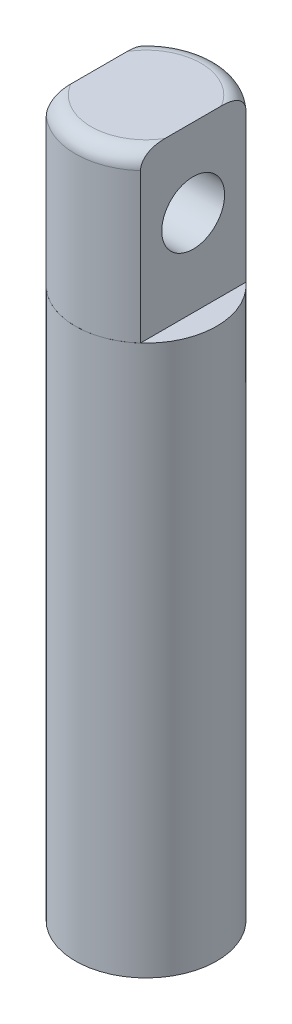
ISO-10303-21;
HEADER;
FILE_DESCRIPTION(('STEP AP214'),'2;1');
FILE_NAME('part.step','',(''),(''),'','','');
FILE_SCHEMA(('AUTOMOTIVE_DESIGN { 1 0 10303 214 1 1 1 1 }'));
ENDSEC;
DATA;
#1=APPLICATION_CONTEXT('core data for automotive mechanical design processes');
#2=APPLICATION_PROTOCOL_DEFINITION('international standard','automotive_design',2000,#1);
#3=PRODUCT_CONTEXT('',#1,'mechanical');
#4=PRODUCT('Part','Part','',(#3));
#5=PRODUCT_RELATED_PRODUCT_CATEGORY('part','',(#4));
#6=PRODUCT_DEFINITION_FORMATION('','',#4);
#7=PRODUCT_DEFINITION_CONTEXT('part definition',#1,'design');
#8=PRODUCT_DEFINITION('design','',#6,#7);
#9=PRODUCT_DEFINITION_SHAPE('','',#8);
#10=(LENGTH_UNIT() NAMED_UNIT(*) SI_UNIT(.MILLI.,.METRE.));
#11=(NAMED_UNIT(*) PLANE_ANGLE_UNIT() SI_UNIT($,.RADIAN.));
#12=(NAMED_UNIT(*) SI_UNIT($,.STERADIAN.) SOLID_ANGLE_UNIT());
#13=UNCERTAINTY_MEASURE_WITH_UNIT(LENGTH_MEASURE(1.E-05),#10,'distance_accuracy_value','');
#14=(GEOMETRIC_REPRESENTATION_CONTEXT(3) GLOBAL_UNCERTAINTY_ASSIGNED_CONTEXT((#13)) GLOBAL_UNIT_ASSIGNED_CONTEXT((#10,
#11,#12)) REPRESENTATION_CONTEXT('',''));
#15=CARTESIAN_POINT('',(0.,0.,0.));
#16=DIRECTION('',(0.,0.,1.));
#17=DIRECTION('',(1.,0.,0.));
#18=AXIS2_PLACEMENT_3D('',#15,#16,#17);
#19=CARTESIAN_POINT('',(0.,-35.,0.));
#20=DIRECTION('',(0.,1.,0.));
#21=DIRECTION('',(0.,0.,1.));
#22=AXIS2_PLACEMENT_3D('',#19,#20,#21);
#23=CYLINDRICAL_SURFACE('',#22,4.5);
#24=CARTESIAN_POINT('',(0.,-35.,0.));
#25=DIRECTION('',(0.,-1.,0.));
#26=DIRECTION('',(0.,0.,-1.));
#27=AXIS2_PLACEMENT_3D('',#24,#25,#26);
#28=CIRCLE('',#27,4.5);
#29=CARTESIAN_POINT('',(0.,-35.,-4.5));
#30=VERTEX_POINT('',#29);
#31=EDGE_CURVE('E11',#30,#30,#28,.T.);
#32=ORIENTED_EDGE('',*,*,#31,.F.);
#33=EDGE_LOOP('',(#32));
#34=FACE_BOUND('',#33,.T.);
#35=CARTESIAN_POINT('',(0.,0.,0.));
#36=DIRECTION('',(0.,-1.,0.));
#37=DIRECTION('',(0.,0.,-1.));
#38=AXIS2_PLACEMENT_3D('',#35,#36,#37);
#39=CIRCLE('',#38,4.5);
#40=CARTESIAN_POINT('',(0.,0.,-4.5));
#41=VERTEX_POINT('',#40);
#42=EDGE_CURVE('E47',#41,#41,#39,.T.);
#43=ORIENTED_EDGE('',*,*,#42,.T.);
#44=EDGE_LOOP('',(#43));
#45=FACE_BOUND('',#44,.T.);
#46=ADVANCED_FACE('F44',(#34,#45),#23,.T.);
#47=CARTESIAN_POINT('',(0.,-35.,0.));
#48=DIRECTION('',(0.,-1.,0.));
#49=DIRECTION('',(0.,0.,-1.));
#50=AXIS2_PLACEMENT_3D('',#47,#48,#49);
#51=PLANE('',#50);
#52=ORIENTED_EDGE('',*,*,#31,.T.);
#53=EDGE_LOOP('',(#52));
#54=FACE_BOUND('',#53,.T.);
#55=ADVANCED_FACE('F59',(#54),#51,.T.);
#56=CARTESIAN_POINT('',(0.,0.,0.));
#57=DIRECTION('',(0.,-1.,0.));
#58=DIRECTION('',(0.,0.,-1.));
#59=AXIS2_PLACEMENT_3D('',#56,#57,#58);
#60=PLANE('',#59);
#61=ORIENTED_EDGE('',*,*,#42,.F.);
#62=EDGE_LOOP('',(#61));
#63=FACE_BOUND('',#62,.T.);
#64=ADVANCED_FACE('F57',(#63),#60,.F.);
#65=CLOSED_SHELL('',(#46,#55,#64));
#66=MANIFOLD_SOLID_BREP('B2',#65);
#67=CARTESIAN_POINT('',(0.,10.5,0.));
#68=DIRECTION('',(0.,-1.,0.));
#69=DIRECTION('',(0.,0.,-1.));
#70=AXIS2_PLACEMENT_3D('',#67,#68,#69);
#71=CYLINDRICAL_SURFACE('',#70,4.5);
#72=DIRECTION('',(0.,1.,0.));
#73=VECTOR('',#72,1.);
#74=CARTESIAN_POINT('',(-3.,0.,-3.35410196624969));
#75=LINE('',#74,#73);
#76=CARTESIAN_POINT('',(-3.,0.,-3.35410196624969));
#77=VERTEX_POINT('',#76);
#78=CARTESIAN_POINT('',(-3.,9.5,-3.35410196624969));
#79=VERTEX_POINT('',#78);
#80=EDGE_CURVE('E145',#77,#79,#75,.T.);
#81=ORIENTED_EDGE('',*,*,#80,.T.);
#82=CARTESIAN_POINT('',(0.,9.5,0.));
#83=DIRECTION('',(0.,1.,0.));
#84=DIRECTION('',(0.,0.,1.));
#85=AXIS2_PLACEMENT_3D('',#82,#83,#84);
#86=CIRCLE('',#85,4.5);
#87=CARTESIAN_POINT('',(3.,9.5,-3.35410196624969));
#88=VERTEX_POINT('',#87);
#89=EDGE_CURVE('E108',#79,#88,#86,.F.);
#90=ORIENTED_EDGE('',*,*,#89,.T.);
#91=DIRECTION('',(0.,1.,0.));
#92=VECTOR('',#91,1.);
#93=CARTESIAN_POINT('',(3.,0.,-3.35410196624969));
#94=LINE('',#93,#92);
#95=CARTESIAN_POINT('',(3.,0.,-3.35410196624969));
#96=VERTEX_POINT('',#95);
#97=EDGE_CURVE('E166',#96,#88,#94,.T.);
#98=ORIENTED_EDGE('',*,*,#97,.F.);
#99=CARTESIAN_POINT('',(0.,0.,0.));
#100=DIRECTION('',(0.,1.,0.));
#101=DIRECTION('',(0.,0.,1.));
#102=AXIS2_PLACEMENT_3D('',#99,#100,#101);
#103=CIRCLE('',#102,4.5);
#104=EDGE_CURVE('E161',#96,#77,#103,.T.);
#105=ORIENTED_EDGE('',*,*,#104,.T.);
#106=EDGE_LOOP('',(#81,#90,#98,#105));
#107=FACE_BOUND('',#106,.T.);
#108=ADVANCED_FACE('F84',(#107),#71,.T.);
#109=DIRECTION('',(0.,1.,0.));
#110=VECTOR('',#109,1.);
#111=CARTESIAN_POINT('',(3.,0.,3.35410196624969));
#112=LINE('',#111,#110);
#113=CARTESIAN_POINT('',(3.,0.,3.35410196624969));
#114=VERTEX_POINT('',#113);
#115=CARTESIAN_POINT('',(3.,9.5,3.35410196624969));
#116=VERTEX_POINT('',#115);
#117=EDGE_CURVE('E236',#114,#116,#112,.T.);
#118=ORIENTED_EDGE('',*,*,#117,.T.);
#119=CARTESIAN_POINT('',(0.,9.5,0.));
#120=DIRECTION('',(0.,1.,0.));
#121=DIRECTION('',(0.,0.,1.));
#122=AXIS2_PLACEMENT_3D('',#119,#120,#121);
#123=CIRCLE('',#122,4.5);
#124=CARTESIAN_POINT('',(-3.,9.5,3.35410196624969));
#125=VERTEX_POINT('',#124);
#126=EDGE_CURVE('E42',#116,#125,#123,.F.);
#127=ORIENTED_EDGE('',*,*,#126,.T.);
#128=DIRECTION('',(0.,1.,0.));
#129=VECTOR('',#128,1.);
#130=CARTESIAN_POINT('',(-3.,0.,3.35410196624969));
#131=LINE('',#130,#129);
#132=CARTESIAN_POINT('',(-3.,0.,3.35410196624969));
#133=VERTEX_POINT('',#132);
#134=EDGE_CURVE('E143',#133,#125,#131,.T.);
#135=ORIENTED_EDGE('',*,*,#134,.F.);
#136=EDGE_CURVE('E155',#133,#114,#103,.T.);
#137=ORIENTED_EDGE('',*,*,#136,.T.);
#138=EDGE_LOOP('',(#118,#127,#135,#137));
#139=FACE_BOUND('',#138,.T.);
#140=ADVANCED_FACE('F154',(#139),#71,.T.);
#141=CARTESIAN_POINT('',(0.,10.5,0.));
#142=DIRECTION('',(0.,1.,0.));
#143=DIRECTION('',(0.,0.,1.));
#144=AXIS2_PLACEMENT_3D('',#141,#142,#143);
#145=PLANE('',#144);
#146=DIRECTION('',(0.,0.,1.));
#147=VECTOR('',#146,1.);
#148=CARTESIAN_POINT('',(3.,10.5,0.));
#149=LINE('',#148,#147);
#150=CARTESIAN_POINT('',(3.,10.5,-1.802775637732));
#151=VERTEX_POINT('',#150);
#152=CARTESIAN_POINT('',(3.,10.5,1.802775637732));
#153=VERTEX_POINT('',#152);
#154=EDGE_CURVE('E226',#151,#153,#149,.T.);
#155=ORIENTED_EDGE('',*,*,#154,.F.);
#156=CARTESIAN_POINT('',(0.,10.5,0.));
#157=DIRECTION('',(0.,1.,0.));
#158=DIRECTION('',(0.,0.,1.));
#159=AXIS2_PLACEMENT_3D('',#156,#157,#158);
#160=CIRCLE('',#159,3.5);
#161=CARTESIAN_POINT('',(-3.,10.5,-1.802775637732));
#162=VERTEX_POINT('',#161);
#163=EDGE_CURVE('E170',#151,#162,#160,.T.);
#164=ORIENTED_EDGE('',*,*,#163,.T.);
#165=DIRECTION('',(0.,0.,1.));
#166=VECTOR('',#165,1.);
#167=CARTESIAN_POINT('',(-3.,10.5,0.));
#168=LINE('',#167,#166);
#169=CARTESIAN_POINT('',(-3.,10.5,1.802775637732));
#170=VERTEX_POINT('',#169);
#171=EDGE_CURVE('E150',#162,#170,#168,.T.);
#172=ORIENTED_EDGE('',*,*,#171,.T.);
#173=CARTESIAN_POINT('',(0.,10.5,0.));
#174=DIRECTION('',(0.,1.,0.));
#175=DIRECTION('',(0.,0.,1.));
#176=AXIS2_PLACEMENT_3D('',#173,#174,#175);
#177=CIRCLE('',#176,3.5);
#178=EDGE_CURVE('E163',#170,#153,#177,.T.);
#179=ORIENTED_EDGE('',*,*,#178,.T.);
#180=EDGE_LOOP('',(#155,#164,#172,#179));
#181=FACE_BOUND('',#180,.T.);
#182=ADVANCED_FACE('F198',(#181),#145,.T.);
#183=CARTESIAN_POINT('',(0.,0.,0.));
#184=DIRECTION('',(0.,1.,0.));
#185=DIRECTION('',(0.,0.,1.));
#186=AXIS2_PLACEMENT_3D('',#183,#184,#185);
#187=PLANE('',#186);
#188=DIRECTION('',(0.,0.,1.));
#189=VECTOR('',#188,1.);
#190=CARTESIAN_POINT('',(-3.,0.,0.));
#191=LINE('',#190,#189);
#192=EDGE_CURVE('E139',#77,#133,#191,.T.);
#193=ORIENTED_EDGE('',*,*,#192,.F.);
#194=ORIENTED_EDGE('',*,*,#104,.F.);
#195=DIRECTION('',(0.,0.,1.));
#196=VECTOR('',#195,1.);
#197=CARTESIAN_POINT('',(3.,0.,0.));
#198=LINE('',#197,#196);
#199=EDGE_CURVE('E160',#96,#114,#198,.T.);
#200=ORIENTED_EDGE('',*,*,#199,.T.);
#201=ORIENTED_EDGE('',*,*,#136,.F.);
#202=EDGE_LOOP('',(#193,#194,#200,#201));
#203=FACE_BOUND('',#202,.T.);
#204=ADVANCED_FACE('F159',(#203),#187,.F.);
#205=CARTESIAN_POINT('',(3.,0.,0.));
#206=DIRECTION('',(-1.,0.,0.));
#207=DIRECTION('',(0.,0.,1.));
#208=AXIS2_PLACEMENT_3D('',#205,#206,#207);
#209=PLANE('',#208);
#210=CARTESIAN_POINT('',(3.,5.5,0.));
#211=DIRECTION('',(-1.,0.,0.));
#212=DIRECTION('',(0.,0.,1.));
#213=AXIS2_PLACEMENT_3D('',#210,#211,#212);
#214=CIRCLE('',#213,2.);
#215=CARTESIAN_POINT('',(3.,5.5,2.));
#216=VERTEX_POINT('',#215);
#217=EDGE_CURVE('E230',#216,#216,#214,.F.);
#218=ORIENTED_EDGE('',*,*,#217,.F.);
#219=EDGE_LOOP('',(#218));
#220=FACE_BOUND('',#219,.T.);
#221=ORIENTED_EDGE('',*,*,#97,.T.);
#222=CARTESIAN_POINT('',(3.,9.5,-3.35410196624969));
#223=CARTESIAN_POINT('',(3.,9.52274386253709,-3.35410454903501));
#224=CARTESIAN_POINT('',(3.,9.54547490016377,-3.35306009469318));
#225=CARTESIAN_POINT('',(3.,9.5907369708359,-3.34891222657833));
#226=CARTESIAN_POINT('',(3.,9.61326809969119,-3.34580985988295));
#227=CARTESIAN_POINT('',(3.,9.68000846709122,-3.33352701165953));
#228=CARTESIAN_POINT('',(3.,9.72370157060511,-3.32136959422299));
#229=CARTESIAN_POINT('',(3.,9.80827186767221,-3.28985961248155));
#230=CARTESIAN_POINT('',(3.,9.84915355415978,-3.27051886023211));
#231=CARTESIAN_POINT('',(3.,9.92741120409648,-3.22563998320875));
#232=CARTESIAN_POINT('',(3.,9.96478118116815,-3.20009153278447));
#233=CARTESIAN_POINT('',(3.,10.0464202089613,-3.13519094673913));
#234=CARTESIAN_POINT('',(3.,10.0892380899997,-3.09401470318977));
#235=CARTESIAN_POINT('',(3.,10.1675578784426,-3.00528363023168));
#236=CARTESIAN_POINT('',(3.,10.2030533625526,-2.95772326044216));
#237=CARTESIAN_POINT('',(3.,10.2794086367998,-2.83879019866428));
#238=CARTESIAN_POINT('',(3.,10.3170109743537,-2.76533540443195));
#239=CARTESIAN_POINT('',(3.,10.380326582716,-2.61322737961961));
#240=CARTESIAN_POINT('',(3.,10.4059753973865,-2.53454852125631));
#241=CARTESIAN_POINT('',(3.,10.4540625323204,-2.34752333041212));
#242=CARTESIAN_POINT('',(3.,10.4724682091914,-2.23815778385163));
#243=CARTESIAN_POINT('',(3.,10.4896598751466,-2.07412278259901));
#244=CARTESIAN_POINT('',(3.,10.4936624497555,-2.01986832136679));
#245=CARTESIAN_POINT('',(3.,10.4988264692374,-1.91133646557868));
#246=CARTESIAN_POINT('',(3.,10.4999939844098,-1.85705936934241));
#247=CARTESIAN_POINT('',(3.,10.5,-1.802775637732));
#248=B_SPLINE_CURVE_WITH_KNOTS('',3,(#222,#223,#224,#225,#226,#227,#228,#229,#230,#231,#232,
#233,#234,#235,#236,#237,#238,#239,#240,#241,#242,#243,#244,#245,#246,#247),.UNSPECIFIED.,.F.,
.F.,(4,2,2,2,2,2,2,2,2,2,2,2,4),(0.,0.0681829439020912,0.136331222513032,0.271631980301878,
0.406711231656837,0.542016725653647,0.719255508547266,0.896649112429328,1.14283280088189,
1.3903290324182,1.72168681209064,1.88484827723546,2.04766007927172),.UNSPECIFIED.);
#249=EDGE_CURVE('E93',#88,#151,#248,.T.);
#250=ORIENTED_EDGE('',*,*,#249,.T.);
#251=ORIENTED_EDGE('',*,*,#154,.T.);
#252=CARTESIAN_POINT('',(3.,10.5,1.802775637732));
#253=CARTESIAN_POINT('',(3.,10.499992786479,1.86473915398204));
#254=CARTESIAN_POINT('',(3.,10.498470309225,1.92675064852258));
#255=CARTESIAN_POINT('',(3.,10.4916379862247,2.05078914657058));
#256=CARTESIAN_POINT('',(3.,10.4863140239824,2.11281534388827));
#257=CARTESIAN_POINT('',(3.,10.4709914155777,2.23730506733931));
#258=CARTESIAN_POINT('',(3.,10.4609206962147,2.2997601730542));
#259=CARTESIAN_POINT('',(3.,10.4352569685175,2.42344502058643));
#260=CARTESIAN_POINT('',(3.,10.4196728475899,2.48467656789303));
#261=CARTESIAN_POINT('',(3.,10.379881616112,2.61234803113835));
#262=CARTESIAN_POINT('',(3.,10.3548711675459,2.6785446493053));
#263=CARTESIAN_POINT('',(3.,10.2957666283954,2.80653228228509));
#264=CARTESIAN_POINT('',(3.,10.2617112040979,2.86834066349001));
#265=CARTESIAN_POINT('',(3.,10.1904697403969,2.97499791757549));
#266=CARTESIAN_POINT('',(3.,10.1548963353062,3.02091493708341));
#267=CARTESIAN_POINT('',(3.,10.0767219196394,3.10641620747324));
#268=CARTESIAN_POINT('',(3.,10.0341245171163,3.14600368922409));
#269=CARTESIAN_POINT('',(3.,9.95104063027708,3.20989194457622));
#270=CARTESIAN_POINT('',(3.,9.91169158069974,3.23566809737303));
#271=CARTESIAN_POINT('',(3.,9.82929895812211,3.28033489364886));
#272=CARTESIAN_POINT('',(3.,9.78626223076905,3.29923796793242));
#273=CARTESIAN_POINT('',(3.,9.70307341355973,3.32720196702576));
#274=CARTESIAN_POINT('',(3.,9.66323678814988,3.33720012624133));
#275=CARTESIAN_POINT('',(3.,9.58228835501476,3.350694048589));
#276=CARTESIAN_POINT('',(3.,9.54117136099152,3.35415849349145));
#277=CARTESIAN_POINT('',(3.,9.5,3.35410196624968));
#278=B_SPLINE_CURVE_WITH_KNOTS('',3,(#252,#253,#254,#255,#256,#257,#258,#259,#260,#261,#262,
#263,#264,#265,#266,#267,#268,#269,#270,#271,#272,#273,#274,#275,#276,#277),.UNSPECIFIED.,.F.,
.F.,(4,2,2,2,2,2,2,2,2,2,2,2,4),(0.,0.185944339614068,0.372582783121775,0.562151158963107,
0.75141533932056,0.963120760811112,1.17393533831199,1.34755258569099,1.52108092644837,
1.66162972471974,1.80192304372537,1.92461580338895,2.04789518942632),.UNSPECIFIED.);
#279=EDGE_CURVE('E100',#153,#116,#278,.T.);
#280=ORIENTED_EDGE('',*,*,#279,.T.);
#281=ORIENTED_EDGE('',*,*,#117,.F.);
#282=ORIENTED_EDGE('',*,*,#199,.F.);
#283=EDGE_LOOP('',(#221,#250,#251,#280,#281,#282));
#284=FACE_BOUND('',#283,.T.);
#285=ADVANCED_FACE('F191',(#220,#284),#209,.F.);
#286=CARTESIAN_POINT('',(-3.,0.,0.));
#287=DIRECTION('',(-1.,0.,0.));
#288=DIRECTION('',(0.,0.,1.));
#289=AXIS2_PLACEMENT_3D('',#286,#287,#288);
#290=PLANE('',#289);
#291=CARTESIAN_POINT('',(-3.,5.5,0.));
#292=DIRECTION('',(-1.,0.,0.));
#293=DIRECTION('',(0.,0.,1.));
#294=AXIS2_PLACEMENT_3D('',#291,#292,#293);
#295=CIRCLE('',#294,2.);
#296=CARTESIAN_POINT('',(-3.,5.5,2.));
#297=VERTEX_POINT('',#296);
#298=EDGE_CURVE('E240',#297,#297,#295,.T.);
#299=ORIENTED_EDGE('',*,*,#298,.F.);
#300=EDGE_LOOP('',(#299));
#301=FACE_BOUND('',#300,.T.);
#302=ORIENTED_EDGE('',*,*,#171,.F.);
#303=CARTESIAN_POINT('',(-3.,10.5,-1.802775637732));
#304=CARTESIAN_POINT('',(-3.,10.499992786479,-1.86473915398204));
#305=CARTESIAN_POINT('',(-3.,10.498470309225,-1.92675064852258));
#306=CARTESIAN_POINT('',(-3.,10.4916379862247,-2.05078914657058));
#307=CARTESIAN_POINT('',(-3.,10.4863140239824,-2.11281534388827));
#308=CARTESIAN_POINT('',(-3.,10.4709914155777,-2.23730506733931));
#309=CARTESIAN_POINT('',(-3.,10.4609206962147,-2.2997601730542));
#310=CARTESIAN_POINT('',(-3.,10.4352569685175,-2.42344502058643));
#311=CARTESIAN_POINT('',(-3.,10.4196728475899,-2.48467656789303));
#312=CARTESIAN_POINT('',(-3.,10.379881616112,-2.61234803113835));
#313=CARTESIAN_POINT('',(-3.,10.3548711675459,-2.6785446493053));
#314=CARTESIAN_POINT('',(-3.,10.2957666283954,-2.80653228228509));
#315=CARTESIAN_POINT('',(-3.,10.2617112040979,-2.86834066349001));
#316=CARTESIAN_POINT('',(-3.,10.1904697403969,-2.97499791757549));
#317=CARTESIAN_POINT('',(-3.,10.1548963353062,-3.02091493708341));
#318=CARTESIAN_POINT('',(-3.,10.0767219196394,-3.10641620747324));
#319=CARTESIAN_POINT('',(-3.,10.0341245171163,-3.14600368922409));
#320=CARTESIAN_POINT('',(-3.,9.95104063027708,-3.20989194457622));
#321=CARTESIAN_POINT('',(-3.,9.91169158069974,-3.23566809737303));
#322=CARTESIAN_POINT('',(-3.,9.82929895812211,-3.28033489364886));
#323=CARTESIAN_POINT('',(-3.,9.78626223076905,-3.29923796793242));
#324=CARTESIAN_POINT('',(-3.,9.70307341355973,-3.32720196702576));
#325=CARTESIAN_POINT('',(-3.,9.66323678814988,-3.33720012624133));
#326=CARTESIAN_POINT('',(-3.,9.58228835501476,-3.350694048589));
#327=CARTESIAN_POINT('',(-3.,9.54117136099152,-3.35415849349145));
#328=CARTESIAN_POINT('',(-3.,9.5,-3.35410196624968));
#329=B_SPLINE_CURVE_WITH_KNOTS('',3,(#303,#304,#305,#306,#307,#308,#309,#310,#311,#312,#313,
#314,#315,#316,#317,#318,#319,#320,#321,#322,#323,#324,#325,#326,#327,#328),.UNSPECIFIED.,.F.,
.F.,(4,2,2,2,2,2,2,2,2,2,2,2,4),(0.,0.185944339614068,0.372582783121775,0.562151158963107,
0.75141533932056,0.963120760811112,1.17393533831199,1.34755258569099,1.52108092644837,
1.66162972471974,1.80192304372537,1.92461580338895,2.04789518942632),.UNSPECIFIED.);
#330=EDGE_CURVE('E180',#162,#79,#329,.T.);
#331=ORIENTED_EDGE('',*,*,#330,.T.);
#332=ORIENTED_EDGE('',*,*,#80,.F.);
#333=ORIENTED_EDGE('',*,*,#192,.T.);
#334=ORIENTED_EDGE('',*,*,#134,.T.);
#335=CARTESIAN_POINT('',(-3.,9.5,3.35410196624969));
#336=CARTESIAN_POINT('',(-3.,9.52274386253709,3.35410454903501));
#337=CARTESIAN_POINT('',(-3.,9.54547490016377,3.35306009469318));
#338=CARTESIAN_POINT('',(-3.,9.5907369708359,3.34891222657833));
#339=CARTESIAN_POINT('',(-3.,9.61326809969119,3.34580985988295));
#340=CARTESIAN_POINT('',(-3.,9.68000846709122,3.33352701165953));
#341=CARTESIAN_POINT('',(-3.,9.72370157060511,3.32136959422299));
#342=CARTESIAN_POINT('',(-3.,9.80827186767221,3.28985961248155));
#343=CARTESIAN_POINT('',(-3.,9.84915355415978,3.27051886023211));
#344=CARTESIAN_POINT('',(-3.,9.92741120409648,3.22563998320875));
#345=CARTESIAN_POINT('',(-3.,9.96478118116815,3.20009153278447));
#346=CARTESIAN_POINT('',(-3.,10.0464202089613,3.13519094673913));
#347=CARTESIAN_POINT('',(-3.,10.0892380899997,3.09401470318977));
#348=CARTESIAN_POINT('',(-3.,10.1675578784426,3.00528363023168));
#349=CARTESIAN_POINT('',(-3.,10.2030533625526,2.95772326044216));
#350=CARTESIAN_POINT('',(-3.,10.2794086367998,2.83879019866428));
#351=CARTESIAN_POINT('',(-3.,10.3170109743537,2.76533540443195));
#352=CARTESIAN_POINT('',(-3.,10.380326582716,2.61322737961961));
#353=CARTESIAN_POINT('',(-3.,10.4059753973865,2.53454852125631));
#354=CARTESIAN_POINT('',(-3.,10.4540625323204,2.34752333041212));
#355=CARTESIAN_POINT('',(-3.,10.4724682091914,2.23815778385163));
#356=CARTESIAN_POINT('',(-3.,10.4896598751466,2.07412278259901));
#357=CARTESIAN_POINT('',(-3.,10.4936624497555,2.01986832136679));
#358=CARTESIAN_POINT('',(-3.,10.4988264692374,1.91133646557868));
#359=CARTESIAN_POINT('',(-3.,10.4999939844098,1.85705936934241));
#360=CARTESIAN_POINT('',(-3.,10.5,1.802775637732));
#361=B_SPLINE_CURVE_WITH_KNOTS('',3,(#335,#336,#337,#338,#339,#340,#341,#342,#343,#344,#345,
#346,#347,#348,#349,#350,#351,#352,#353,#354,#355,#356,#357,#358,#359,#360),.UNSPECIFIED.,.F.,
.F.,(4,2,2,2,2,2,2,2,2,2,2,2,4),(0.,0.0681829439020912,0.136331222513032,0.271631980301878,
0.406711231656837,0.542016725653647,0.719255508547266,0.896649112429328,1.14283280088189,
1.3903290324182,1.72168681209064,1.88484827723546,2.04766007927172),.UNSPECIFIED.);
#362=EDGE_CURVE('E173',#125,#170,#361,.T.);
#363=ORIENTED_EDGE('',*,*,#362,.T.);
#364=EDGE_LOOP('',(#302,#331,#332,#333,#334,#363));
#365=FACE_BOUND('',#364,.T.);
#366=ADVANCED_FACE('F142',(#301,#365),#290,.T.);
#367=CARTESIAN_POINT('',(3.001,5.5,0.));
#368=DIRECTION('',(-1.,0.,0.));
#369=DIRECTION('',(0.,0.,1.));
#370=AXIS2_PLACEMENT_3D('',#367,#368,#369);
#371=CYLINDRICAL_SURFACE('',#370,2.);
#372=ORIENTED_EDGE('',*,*,#298,.T.);
#373=EDGE_LOOP('',(#372));
#374=FACE_BOUND('',#373,.T.);
#375=ORIENTED_EDGE('',*,*,#217,.T.);
#376=EDGE_LOOP('',(#375));
#377=FACE_BOUND('',#376,.T.);
#378=ADVANCED_FACE('F190',(#374,#377),#371,.F.);
#379=CARTESIAN_POINT('',(0.,9.5,0.));
#380=DIRECTION('',(0.,1.,0.));
#381=DIRECTION('',(0.,0.,1.));
#382=AXIS2_PLACEMENT_3D('',#379,#380,#381);
#383=TOROIDAL_SURFACE('',#382,3.5,1.);
#384=ORIENTED_EDGE('',*,*,#249,.F.);
#385=ORIENTED_EDGE('',*,*,#89,.F.);
#386=ORIENTED_EDGE('',*,*,#330,.F.);
#387=ORIENTED_EDGE('',*,*,#163,.F.);
#388=EDGE_LOOP('',(#384,#385,#386,#387));
#389=FACE_BOUND('',#388,.T.);
#390=ADVANCED_FACE('F210',(#389),#383,.T.);
#391=CARTESIAN_POINT('',(0.,9.5,0.));
#392=DIRECTION('',(0.,1.,0.));
#393=DIRECTION('',(0.,0.,1.));
#394=AXIS2_PLACEMENT_3D('',#391,#392,#393);
#395=TOROIDAL_SURFACE('',#394,3.5,1.);
#396=ORIENTED_EDGE('',*,*,#362,.F.);
#397=ORIENTED_EDGE('',*,*,#126,.F.);
#398=ORIENTED_EDGE('',*,*,#279,.F.);
#399=ORIENTED_EDGE('',*,*,#178,.F.);
#400=EDGE_LOOP('',(#396,#397,#398,#399));
#401=FACE_BOUND('',#400,.T.);
#402=ADVANCED_FACE('F86',(#401),#395,.T.);
#403=CLOSED_SHELL('',(#108,#140,#182,#204,#285,#366,#378,#390,#402));
#404=MANIFOLD_SOLID_BREP('B6',#403);
#405=ADVANCED_BREP_SHAPE_REPRESENTATION('',(#18,#66,#404),#14);
#406=SHAPE_DEFINITION_REPRESENTATION(#9,#405);
ENDSEC;
END-ISO-10303-21;
